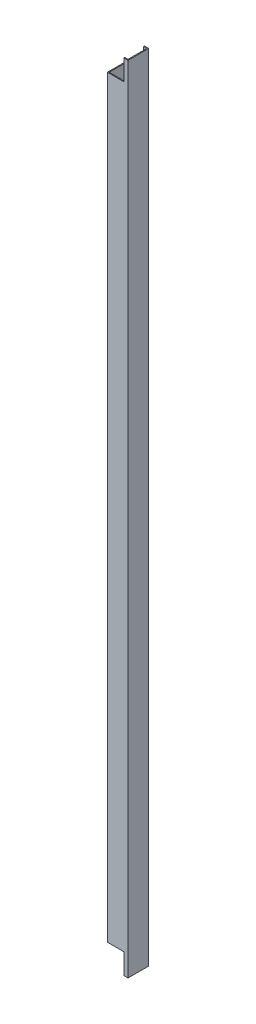
ISO-10303-21;
HEADER;
FILE_DESCRIPTION(('STEP AP214'),'2;1');
FILE_NAME('part.step','',(''),(''),'','','');
FILE_SCHEMA(('AUTOMOTIVE_DESIGN { 1 0 10303 214 1 1 1 1 }'));
ENDSEC;
DATA;
#1=APPLICATION_CONTEXT('core data for automotive mechanical design processes');
#2=APPLICATION_PROTOCOL_DEFINITION('international standard','automotive_design',2000,#1);
#3=PRODUCT_CONTEXT('',#1,'mechanical');
#4=PRODUCT('Part','Part','',(#3));
#5=PRODUCT_RELATED_PRODUCT_CATEGORY('part','',(#4));
#6=PRODUCT_DEFINITION_FORMATION('','',#4);
#7=PRODUCT_DEFINITION_CONTEXT('part definition',#1,'design');
#8=PRODUCT_DEFINITION('design','',#6,#7);
#9=PRODUCT_DEFINITION_SHAPE('','',#8);
#10=(LENGTH_UNIT() NAMED_UNIT(*) SI_UNIT(.MILLI.,.METRE.));
#11=(NAMED_UNIT(*) PLANE_ANGLE_UNIT() SI_UNIT($,.RADIAN.));
#12=(NAMED_UNIT(*) SI_UNIT($,.STERADIAN.) SOLID_ANGLE_UNIT());
#13=UNCERTAINTY_MEASURE_WITH_UNIT(LENGTH_MEASURE(1.E-05),#10,'distance_accuracy_value','');
#14=(GEOMETRIC_REPRESENTATION_CONTEXT(3) GLOBAL_UNCERTAINTY_ASSIGNED_CONTEXT((#13)) GLOBAL_UNIT_ASSIGNED_CONTEXT((#10,
#11,#12)) REPRESENTATION_CONTEXT('',''));
#15=CARTESIAN_POINT('',(0.,0.,0.));
#16=DIRECTION('',(0.,0.,1.));
#17=DIRECTION('',(1.,0.,0.));
#18=AXIS2_PLACEMENT_3D('',#15,#16,#17);
#19=CARTESIAN_POINT('',(0.,1923.,0.));
#20=DIRECTION('',(0.,-1.,0.));
#21=DIRECTION('',(0.,0.,-1.));
#22=AXIS2_PLACEMENT_3D('',#19,#20,#21);
#23=PLANE('',#22);
#24=DIRECTION('',(-1.,0.,0.));
#25=VECTOR('',#24,1.);
#26=CARTESIAN_POINT('',(0.,1923.,-50.));
#27=LINE('',#26,#25);
#28=CARTESIAN_POINT('',(50.,1923.,-50.));
#29=VERTEX_POINT('',#28);
#30=CARTESIAN_POINT('',(40.,1923.,-50.));
#31=VERTEX_POINT('',#30);
#32=EDGE_CURVE('E184',#29,#31,#27,.T.);
#33=ORIENTED_EDGE('',*,*,#32,.T.);
#34=DIRECTION('',(0.,0.,1.));
#35=VECTOR('',#34,1.);
#36=CARTESIAN_POINT('',(40.,1923.,-50.));
#37=LINE('',#36,#35);
#38=CARTESIAN_POINT('',(40.,1923.,-47.8));
#39=VERTEX_POINT('',#38);
#40=EDGE_CURVE('E257',#31,#39,#37,.T.);
#41=ORIENTED_EDGE('',*,*,#40,.T.);
#42=DIRECTION('',(-1.,0.,0.));
#43=VECTOR('',#42,1.);
#44=CARTESIAN_POINT('',(2.2,1923.,-47.8));
#45=LINE('',#44,#43);
#46=CARTESIAN_POINT('',(47.8,1923.,-47.8));
#47=VERTEX_POINT('',#46);
#48=EDGE_CURVE('E208',#47,#39,#45,.T.);
#49=ORIENTED_EDGE('',*,*,#48,.F.);
#50=DIRECTION('',(0.,0.,-1.));
#51=VECTOR('',#50,1.);
#52=CARTESIAN_POINT('',(47.8,1923.,-47.8));
#53=LINE('',#52,#51);
#54=CARTESIAN_POINT('',(47.8,1923.,-2.2));
#55=VERTEX_POINT('',#54);
#56=EDGE_CURVE('E213',#55,#47,#53,.T.);
#57=ORIENTED_EDGE('',*,*,#56,.F.);
#58=DIRECTION('',(1.,0.,0.));
#59=VECTOR('',#58,1.);
#60=CARTESIAN_POINT('',(47.8,1923.,-2.2));
#61=LINE('',#60,#59);
#62=CARTESIAN_POINT('',(40.,1923.,-2.2));
#63=VERTEX_POINT('',#62);
#64=EDGE_CURVE('E277',#63,#55,#61,.T.);
#65=ORIENTED_EDGE('',*,*,#64,.F.);
#66=CARTESIAN_POINT('',(40.,1923.,0.));
#67=VERTEX_POINT('',#66);
#68=EDGE_CURVE('E241',#63,#67,#37,.T.);
#69=ORIENTED_EDGE('',*,*,#68,.T.);
#70=DIRECTION('',(1.,0.,0.));
#71=VECTOR('',#70,1.);
#72=CARTESIAN_POINT('',(50.,1923.,0.));
#73=LINE('',#72,#71);
#74=CARTESIAN_POINT('',(50.,1923.,0.));
#75=VERTEX_POINT('',#74);
#76=EDGE_CURVE('E171',#67,#75,#73,.T.);
#77=ORIENTED_EDGE('',*,*,#76,.T.);
#78=DIRECTION('',(0.,0.,-1.));
#79=VECTOR('',#78,1.);
#80=CARTESIAN_POINT('',(50.,1923.,-50.));
#81=LINE('',#80,#79);
#82=EDGE_CURVE('E174',#75,#29,#81,.T.);
#83=ORIENTED_EDGE('',*,*,#82,.T.);
#84=EDGE_LOOP('',(#33,#41,#49,#57,#65,#69,#77,#83));
#85=FACE_BOUND('',#84,.T.);
#86=ADVANCED_FACE('F33',(#85),#23,.F.);
#87=CARTESIAN_POINT('',(0.,0.,0.));
#88=DIRECTION('',(0.,-1.,0.));
#89=DIRECTION('',(0.,0.,-1.));
#90=AXIS2_PLACEMENT_3D('',#87,#88,#89);
#91=PLANE('',#90);
#92=DIRECTION('',(0.,0.,1.));
#93=VECTOR('',#92,1.);
#94=CARTESIAN_POINT('',(40.,0.,-50.));
#95=LINE('',#94,#93);
#96=CARTESIAN_POINT('',(40.,0.,-50.));
#97=VERTEX_POINT('',#96);
#98=CARTESIAN_POINT('',(40.,0.,-47.8));
#99=VERTEX_POINT('',#98);
#100=EDGE_CURVE('E56',#97,#99,#95,.T.);
#101=ORIENTED_EDGE('',*,*,#100,.F.);
#102=DIRECTION('',(-1.,0.,0.));
#103=VECTOR('',#102,1.);
#104=CARTESIAN_POINT('',(0.,0.,-50.));
#105=LINE('',#104,#103);
#106=CARTESIAN_POINT('',(50.,0.,-50.));
#107=VERTEX_POINT('',#106);
#108=EDGE_CURVE('E159',#107,#97,#105,.T.);
#109=ORIENTED_EDGE('',*,*,#108,.F.);
#110=DIRECTION('',(0.,0.,-1.));
#111=VECTOR('',#110,1.);
#112=CARTESIAN_POINT('',(50.,0.,-50.));
#113=LINE('',#112,#111);
#114=CARTESIAN_POINT('',(50.,0.,0.));
#115=VERTEX_POINT('',#114);
#116=EDGE_CURVE('E172',#115,#107,#113,.T.);
#117=ORIENTED_EDGE('',*,*,#116,.F.);
#118=DIRECTION('',(1.,0.,0.));
#119=VECTOR('',#118,1.);
#120=CARTESIAN_POINT('',(50.,0.,0.));
#121=LINE('',#120,#119);
#122=CARTESIAN_POINT('',(40.,0.,0.));
#123=VERTEX_POINT('',#122);
#124=EDGE_CURVE('E176',#123,#115,#121,.T.);
#125=ORIENTED_EDGE('',*,*,#124,.F.);
#126=CARTESIAN_POINT('',(40.,0.,-2.2));
#127=VERTEX_POINT('',#126);
#128=EDGE_CURVE('E164',#127,#123,#95,.T.);
#129=ORIENTED_EDGE('',*,*,#128,.F.);
#130=DIRECTION('',(1.,0.,0.));
#131=VECTOR('',#130,1.);
#132=CARTESIAN_POINT('',(47.8,0.,-2.2));
#133=LINE('',#132,#131);
#134=CARTESIAN_POINT('',(47.8,0.,-2.2));
#135=VERTEX_POINT('',#134);
#136=EDGE_CURVE('E276',#127,#135,#133,.T.);
#137=ORIENTED_EDGE('',*,*,#136,.T.);
#138=DIRECTION('',(0.,0.,-1.));
#139=VECTOR('',#138,1.);
#140=CARTESIAN_POINT('',(47.8,0.,-47.8));
#141=LINE('',#140,#139);
#142=CARTESIAN_POINT('',(47.8,0.,-47.8));
#143=VERTEX_POINT('',#142);
#144=EDGE_CURVE('E281',#135,#143,#141,.T.);
#145=ORIENTED_EDGE('',*,*,#144,.T.);
#146=DIRECTION('',(-1.,0.,0.));
#147=VECTOR('',#146,1.);
#148=CARTESIAN_POINT('',(2.2,0.,-47.8));
#149=LINE('',#148,#147);
#150=EDGE_CURVE('E162',#143,#99,#149,.T.);
#151=ORIENTED_EDGE('',*,*,#150,.T.);
#152=EDGE_LOOP('',(#101,#109,#117,#125,#129,#137,#145,#151));
#153=FACE_BOUND('',#152,.T.);
#154=ADVANCED_FACE('F157',(#153),#91,.T.);
#155=CARTESIAN_POINT('',(50.,1923.,0.));
#156=DIRECTION('',(0.,0.,-1.));
#157=DIRECTION('',(-1.,0.,0.));
#158=AXIS2_PLACEMENT_3D('',#155,#156,#157);
#159=PLANE('',#158);
#160=DIRECTION('',(0.,-1.,0.));
#161=VECTOR('',#160,1.);
#162=CARTESIAN_POINT('',(0.,1923.,0.));
#163=LINE('',#162,#161);
#164=CARTESIAN_POINT('',(0.,1873.,0.));
#165=VERTEX_POINT('',#164);
#166=CARTESIAN_POINT('',(0.,50.,0.));
#167=VERTEX_POINT('',#166);
#168=EDGE_CURVE('E180',#165,#167,#163,.T.);
#169=ORIENTED_EDGE('',*,*,#168,.T.);
#170=DIRECTION('',(-1.,0.,0.));
#171=VECTOR('',#170,1.);
#172=CARTESIAN_POINT('',(0.,50.,0.));
#173=LINE('',#172,#171);
#174=CARTESIAN_POINT('',(40.,50.,0.));
#175=VERTEX_POINT('',#174);
#176=EDGE_CURVE('E152',#175,#167,#173,.T.);
#177=ORIENTED_EDGE('',*,*,#176,.F.);
#178=DIRECTION('',(0.,1.,0.));
#179=VECTOR('',#178,1.);
#180=CARTESIAN_POINT('',(40.,50.,0.));
#181=LINE('',#180,#179);
#182=EDGE_CURVE('E232',#123,#175,#181,.T.);
#183=ORIENTED_EDGE('',*,*,#182,.F.);
#184=ORIENTED_EDGE('',*,*,#124,.T.);
#185=DIRECTION('',(0.,-1.,0.));
#186=VECTOR('',#185,1.);
#187=CARTESIAN_POINT('',(50.,1923.,0.));
#188=LINE('',#187,#186);
#189=EDGE_CURVE('E188',#75,#115,#188,.T.);
#190=ORIENTED_EDGE('',*,*,#189,.F.);
#191=ORIENTED_EDGE('',*,*,#76,.F.);
#192=DIRECTION('',(0.,1.,0.));
#193=VECTOR('',#192,1.);
#194=CARTESIAN_POINT('',(40.,1923.,0.));
#195=LINE('',#194,#193);
#196=CARTESIAN_POINT('',(40.,1873.,0.));
#197=VERTEX_POINT('',#196);
#198=EDGE_CURVE('E244',#197,#67,#195,.T.);
#199=ORIENTED_EDGE('',*,*,#198,.F.);
#200=DIRECTION('',(1.,0.,0.));
#201=VECTOR('',#200,1.);
#202=CARTESIAN_POINT('',(40.,1873.,0.));
#203=LINE('',#202,#201);
#204=EDGE_CURVE('E246',#165,#197,#203,.T.);
#205=ORIENTED_EDGE('',*,*,#204,.F.);
#206=EDGE_LOOP('',(#169,#177,#183,#184,#190,#191,#199,#205));
#207=FACE_BOUND('',#206,.T.);
#208=ADVANCED_FACE('F35',(#207),#159,.F.);
#209=CARTESIAN_POINT('',(50.,1923.,-50.));
#210=DIRECTION('',(-1.,0.,0.));
#211=DIRECTION('',(0.,0.,1.));
#212=AXIS2_PLACEMENT_3D('',#209,#210,#211);
#213=PLANE('',#212);
#214=ORIENTED_EDGE('',*,*,#116,.T.);
#215=DIRECTION('',(0.,-1.,0.));
#216=VECTOR('',#215,1.);
#217=CARTESIAN_POINT('',(50.,1923.,-50.));
#218=LINE('',#217,#216);
#219=EDGE_CURVE('E170',#29,#107,#218,.T.);
#220=ORIENTED_EDGE('',*,*,#219,.F.);
#221=ORIENTED_EDGE('',*,*,#82,.F.);
#222=ORIENTED_EDGE('',*,*,#189,.T.);
#223=EDGE_LOOP('',(#214,#220,#221,#222));
#224=FACE_BOUND('',#223,.T.);
#225=ADVANCED_FACE('F236',(#224),#213,.F.);
#226=CARTESIAN_POINT('',(0.,1923.,-50.));
#227=DIRECTION('',(0.,0.,1.));
#228=DIRECTION('',(1.,0.,0.));
#229=AXIS2_PLACEMENT_3D('',#226,#227,#228);
#230=PLANE('',#229);
#231=DIRECTION('',(0.,1.,0.));
#232=VECTOR('',#231,1.);
#233=CARTESIAN_POINT('',(40.,50.,-50.));
#234=LINE('',#233,#232);
#235=CARTESIAN_POINT('',(40.,50.,-50.));
#236=VERTEX_POINT('',#235);
#237=EDGE_CURVE('E143',#97,#236,#234,.T.);
#238=ORIENTED_EDGE('',*,*,#237,.T.);
#239=DIRECTION('',(-1.,0.,0.));
#240=VECTOR('',#239,1.);
#241=CARTESIAN_POINT('',(0.,50.,-50.));
#242=LINE('',#241,#240);
#243=CARTESIAN_POINT('',(0.,50.,-50.));
#244=VERTEX_POINT('',#243);
#245=EDGE_CURVE('E151',#236,#244,#242,.T.);
#246=ORIENTED_EDGE('',*,*,#245,.T.);
#247=DIRECTION('',(0.,-1.,0.));
#248=VECTOR('',#247,1.);
#249=CARTESIAN_POINT('',(0.,1923.,-50.));
#250=LINE('',#249,#248);
#251=CARTESIAN_POINT('',(0.,1873.,-50.));
#252=VERTEX_POINT('',#251);
#253=EDGE_CURVE('E183',#252,#244,#250,.T.);
#254=ORIENTED_EDGE('',*,*,#253,.F.);
#255=DIRECTION('',(1.,0.,0.));
#256=VECTOR('',#255,1.);
#257=CARTESIAN_POINT('',(40.,1873.,-50.));
#258=LINE('',#257,#256);
#259=CARTESIAN_POINT('',(40.,1873.,-50.));
#260=VERTEX_POINT('',#259);
#261=EDGE_CURVE('E249',#252,#260,#258,.T.);
#262=ORIENTED_EDGE('',*,*,#261,.T.);
#263=DIRECTION('',(0.,1.,0.));
#264=VECTOR('',#263,1.);
#265=CARTESIAN_POINT('',(40.,1923.,-50.));
#266=LINE('',#265,#264);
#267=EDGE_CURVE('E252',#260,#31,#266,.T.);
#268=ORIENTED_EDGE('',*,*,#267,.T.);
#269=ORIENTED_EDGE('',*,*,#32,.F.);
#270=ORIENTED_EDGE('',*,*,#219,.T.);
#271=ORIENTED_EDGE('',*,*,#108,.T.);
#272=EDGE_LOOP('',(#238,#246,#254,#262,#268,#269,#270,#271));
#273=FACE_BOUND('',#272,.T.);
#274=ADVANCED_FACE('F167',(#273),#230,.F.);
#275=CARTESIAN_POINT('',(0.,1923.,0.));
#276=DIRECTION('',(1.,0.,0.));
#277=DIRECTION('',(0.,0.,-1.));
#278=AXIS2_PLACEMENT_3D('',#275,#276,#277);
#279=PLANE('',#278);
#280=ORIENTED_EDGE('',*,*,#253,.T.);
#281=DIRECTION('',(0.,0.,1.));
#282=VECTOR('',#281,1.);
#283=CARTESIAN_POINT('',(0.,50.,-50.));
#284=LINE('',#283,#282);
#285=EDGE_CURVE('E199',#244,#167,#284,.T.);
#286=ORIENTED_EDGE('',*,*,#285,.T.);
#287=ORIENTED_EDGE('',*,*,#168,.F.);
#288=DIRECTION('',(0.,0.,1.));
#289=VECTOR('',#288,1.);
#290=CARTESIAN_POINT('',(0.,1873.,-50.));
#291=LINE('',#290,#289);
#292=EDGE_CURVE('E263',#252,#165,#291,.T.);
#293=ORIENTED_EDGE('',*,*,#292,.F.);
#294=EDGE_LOOP('',(#280,#286,#287,#293));
#295=FACE_BOUND('',#294,.T.);
#296=ADVANCED_FACE('F314',(#295),#279,.F.);
#297=CARTESIAN_POINT('',(2.2,1923.,-2.2));
#298=DIRECTION('',(1.,0.,0.));
#299=DIRECTION('',(0.,0.,-1.));
#300=AXIS2_PLACEMENT_3D('',#297,#298,#299);
#301=PLANE('',#300);
#302=DIRECTION('',(0.,0.,1.));
#303=VECTOR('',#302,1.);
#304=CARTESIAN_POINT('',(2.2,50.,-2.2));
#305=LINE('',#304,#303);
#306=CARTESIAN_POINT('',(2.2,50.,-47.8));
#307=VERTEX_POINT('',#306);
#308=CARTESIAN_POINT('',(2.2,50.,-2.2));
#309=VERTEX_POINT('',#308);
#310=EDGE_CURVE('E272',#307,#309,#305,.T.);
#311=ORIENTED_EDGE('',*,*,#310,.F.);
#312=DIRECTION('',(0.,-1.,0.));
#313=VECTOR('',#312,1.);
#314=CARTESIAN_POINT('',(2.2,1923.,-47.8));
#315=LINE('',#314,#313);
#316=CARTESIAN_POINT('',(2.2,1873.,-47.8));
#317=VERTEX_POINT('',#316);
#318=EDGE_CURVE('E204',#317,#307,#315,.T.);
#319=ORIENTED_EDGE('',*,*,#318,.F.);
#320=DIRECTION('',(0.,0.,-1.));
#321=VECTOR('',#320,1.);
#322=CARTESIAN_POINT('',(2.2,1873.,-2.2));
#323=LINE('',#322,#321);
#324=CARTESIAN_POINT('',(2.2,1873.,-2.2));
#325=VERTEX_POINT('',#324);
#326=EDGE_CURVE('E48',#325,#317,#323,.T.);
#327=ORIENTED_EDGE('',*,*,#326,.F.);
#328=DIRECTION('',(0.,-1.,0.));
#329=VECTOR('',#328,1.);
#330=CARTESIAN_POINT('',(2.2,1923.,-2.2));
#331=LINE('',#330,#329);
#332=EDGE_CURVE('E220',#325,#309,#331,.T.);
#333=ORIENTED_EDGE('',*,*,#332,.T.);
#334=EDGE_LOOP('',(#311,#319,#327,#333));
#335=FACE_BOUND('',#334,.T.);
#336=ADVANCED_FACE('F315',(#335),#301,.T.);
#337=CARTESIAN_POINT('',(47.8,1923.,-2.2));
#338=DIRECTION('',(0.,0.,-1.));
#339=DIRECTION('',(-1.,0.,0.));
#340=AXIS2_PLACEMENT_3D('',#337,#338,#339);
#341=PLANE('',#340);
#342=DIRECTION('',(1.,0.,0.));
#343=VECTOR('',#342,1.);
#344=CARTESIAN_POINT('',(47.8,50.,-2.2));
#345=LINE('',#344,#343);
#346=CARTESIAN_POINT('',(40.,50.,-2.2));
#347=VERTEX_POINT('',#346);
#348=EDGE_CURVE('E274',#309,#347,#345,.T.);
#349=ORIENTED_EDGE('',*,*,#348,.F.);
#350=ORIENTED_EDGE('',*,*,#332,.F.);
#351=DIRECTION('',(-1.,0.,0.));
#352=VECTOR('',#351,1.);
#353=CARTESIAN_POINT('',(47.8,1873.,-2.2));
#354=LINE('',#353,#352);
#355=CARTESIAN_POINT('',(40.,1873.,-2.2));
#356=VERTEX_POINT('',#355);
#357=EDGE_CURVE('E266',#356,#325,#354,.T.);
#358=ORIENTED_EDGE('',*,*,#357,.F.);
#359=DIRECTION('',(0.,-1.,0.));
#360=VECTOR('',#359,1.);
#361=CARTESIAN_POINT('',(40.,1923.,-2.2));
#362=LINE('',#361,#360);
#363=EDGE_CURVE('E268',#63,#356,#362,.T.);
#364=ORIENTED_EDGE('',*,*,#363,.F.);
#365=ORIENTED_EDGE('',*,*,#64,.T.);
#366=DIRECTION('',(0.,-1.,0.));
#367=VECTOR('',#366,1.);
#368=CARTESIAN_POINT('',(47.8,1923.,-2.2));
#369=LINE('',#368,#367);
#370=EDGE_CURVE('E210',#55,#135,#369,.T.);
#371=ORIENTED_EDGE('',*,*,#370,.T.);
#372=ORIENTED_EDGE('',*,*,#136,.F.);
#373=DIRECTION('',(0.,-1.,0.));
#374=VECTOR('',#373,1.);
#375=CARTESIAN_POINT('',(39.9999999999997,1923.,-2.2));
#376=LINE('',#375,#374);
#377=EDGE_CURVE('E270',#347,#127,#376,.T.);
#378=ORIENTED_EDGE('',*,*,#377,.F.);
#379=EDGE_LOOP('',(#349,#350,#358,#364,#365,#371,#372,#378));
#380=FACE_BOUND('',#379,.T.);
#381=ADVANCED_FACE('F305',(#380),#341,.T.);
#382=CARTESIAN_POINT('',(47.8,1923.,-47.8));
#383=DIRECTION('',(-1.,0.,0.));
#384=DIRECTION('',(0.,0.,1.));
#385=AXIS2_PLACEMENT_3D('',#382,#383,#384);
#386=PLANE('',#385);
#387=ORIENTED_EDGE('',*,*,#144,.F.);
#388=ORIENTED_EDGE('',*,*,#370,.F.);
#389=ORIENTED_EDGE('',*,*,#56,.T.);
#390=DIRECTION('',(0.,-1.,0.));
#391=VECTOR('',#390,1.);
#392=CARTESIAN_POINT('',(47.8,1923.,-47.8));
#393=LINE('',#392,#391);
#394=EDGE_CURVE('E207',#47,#143,#393,.T.);
#395=ORIENTED_EDGE('',*,*,#394,.T.);
#396=EDGE_LOOP('',(#387,#388,#389,#395));
#397=FACE_BOUND('',#396,.T.);
#398=ADVANCED_FACE('F286',(#397),#386,.T.);
#399=CARTESIAN_POINT('',(2.2,1923.,-47.8));
#400=DIRECTION('',(0.,0.,1.));
#401=DIRECTION('',(1.,0.,0.));
#402=AXIS2_PLACEMENT_3D('',#399,#400,#401);
#403=PLANE('',#402);
#404=DIRECTION('',(-1.,0.,0.));
#405=VECTOR('',#404,1.);
#406=CARTESIAN_POINT('',(2.2,50.,-47.8));
#407=LINE('',#406,#405);
#408=CARTESIAN_POINT('',(40.,50.,-47.8));
#409=VERTEX_POINT('',#408);
#410=EDGE_CURVE('E11',#409,#307,#407,.T.);
#411=ORIENTED_EDGE('',*,*,#410,.F.);
#412=DIRECTION('',(0.,1.,0.));
#413=VECTOR('',#412,1.);
#414=CARTESIAN_POINT('',(39.9999999999997,1923.,-47.8));
#415=LINE('',#414,#413);
#416=EDGE_CURVE('E41',#99,#409,#415,.T.);
#417=ORIENTED_EDGE('',*,*,#416,.F.);
#418=ORIENTED_EDGE('',*,*,#150,.F.);
#419=ORIENTED_EDGE('',*,*,#394,.F.);
#420=ORIENTED_EDGE('',*,*,#48,.T.);
#421=DIRECTION('',(0.,1.,0.));
#422=VECTOR('',#421,1.);
#423=CARTESIAN_POINT('',(40.,1923.,-47.8));
#424=LINE('',#423,#422);
#425=CARTESIAN_POINT('',(40.,1873.,-47.8));
#426=VERTEX_POINT('',#425);
#427=EDGE_CURVE('E193',#426,#39,#424,.T.);
#428=ORIENTED_EDGE('',*,*,#427,.F.);
#429=DIRECTION('',(1.,0.,0.));
#430=VECTOR('',#429,1.);
#431=CARTESIAN_POINT('',(2.2,1873.,-47.8));
#432=LINE('',#431,#430);
#433=EDGE_CURVE('E191',#317,#426,#432,.T.);
#434=ORIENTED_EDGE('',*,*,#433,.F.);
#435=ORIENTED_EDGE('',*,*,#318,.T.);
#436=EDGE_LOOP('',(#411,#417,#418,#419,#420,#428,#434,#435));
#437=FACE_BOUND('',#436,.T.);
#438=ADVANCED_FACE('F202',(#437),#403,.T.);
#439=CARTESIAN_POINT('',(40.,1923.,-50.));
#440=DIRECTION('',(1.,0.,0.));
#441=DIRECTION('',(0.,1.,0.));
#442=AXIS2_PLACEMENT_3D('',#439,#440,#441);
#443=PLANE('',#442);
#444=ORIENTED_EDGE('',*,*,#363,.T.);
#445=DIRECTION('',(0.,0.,1.));
#446=VECTOR('',#445,1.);
#447=CARTESIAN_POINT('',(40.,1873.,-50.));
#448=LINE('',#447,#446);
#449=EDGE_CURVE('E262',#356,#197,#448,.T.);
#450=ORIENTED_EDGE('',*,*,#449,.T.);
#451=ORIENTED_EDGE('',*,*,#198,.T.);
#452=ORIENTED_EDGE('',*,*,#68,.F.);
#453=EDGE_LOOP('',(#444,#450,#451,#452));
#454=FACE_BOUND('',#453,.T.);
#455=ADVANCED_FACE('F310',(#454),#443,.F.);
#456=ORIENTED_EDGE('',*,*,#427,.T.);
#457=ORIENTED_EDGE('',*,*,#40,.F.);
#458=ORIENTED_EDGE('',*,*,#267,.F.);
#459=EDGE_CURVE('E259',#260,#426,#448,.T.);
#460=ORIENTED_EDGE('',*,*,#459,.T.);
#461=EDGE_LOOP('',(#456,#457,#458,#460));
#462=FACE_BOUND('',#461,.T.);
#463=ADVANCED_FACE('F292',(#462),#443,.F.);
#464=CARTESIAN_POINT('',(40.,1873.,-50.));
#465=DIRECTION('',(0.,-1.,0.));
#466=DIRECTION('',(0.,0.,-1.));
#467=AXIS2_PLACEMENT_3D('',#464,#465,#466);
#468=PLANE('',#467);
#469=ORIENTED_EDGE('',*,*,#357,.T.);
#470=ORIENTED_EDGE('',*,*,#326,.T.);
#471=ORIENTED_EDGE('',*,*,#433,.T.);
#472=ORIENTED_EDGE('',*,*,#459,.F.);
#473=ORIENTED_EDGE('',*,*,#261,.F.);
#474=ORIENTED_EDGE('',*,*,#292,.T.);
#475=ORIENTED_EDGE('',*,*,#204,.T.);
#476=ORIENTED_EDGE('',*,*,#449,.F.);
#477=EDGE_LOOP('',(#469,#470,#471,#472,#473,#474,#475,#476));
#478=FACE_BOUND('',#477,.T.);
#479=ADVANCED_FACE('F311',(#478),#468,.F.);
#480=CARTESIAN_POINT('',(40.,50.,-50.));
#481=DIRECTION('',(1.,0.,0.));
#482=DIRECTION('',(0.,1.,0.));
#483=AXIS2_PLACEMENT_3D('',#480,#481,#482);
#484=PLANE('',#483);
#485=ORIENTED_EDGE('',*,*,#377,.T.);
#486=ORIENTED_EDGE('',*,*,#128,.T.);
#487=ORIENTED_EDGE('',*,*,#182,.T.);
#488=DIRECTION('',(0.,0.,1.));
#489=VECTOR('',#488,1.);
#490=CARTESIAN_POINT('',(40.,50.,-50.));
#491=LINE('',#490,#489);
#492=EDGE_CURVE('E163',#347,#175,#491,.T.);
#493=ORIENTED_EDGE('',*,*,#492,.F.);
#494=EDGE_LOOP('',(#485,#486,#487,#493));
#495=FACE_BOUND('',#494,.T.);
#496=ADVANCED_FACE('F300',(#495),#484,.F.);
#497=CARTESIAN_POINT('',(0.,50.,-50.));
#498=DIRECTION('',(0.,1.,0.));
#499=DIRECTION('',(0.,0.,1.));
#500=AXIS2_PLACEMENT_3D('',#497,#498,#499);
#501=PLANE('',#500);
#502=ORIENTED_EDGE('',*,*,#348,.T.);
#503=ORIENTED_EDGE('',*,*,#492,.T.);
#504=ORIENTED_EDGE('',*,*,#176,.T.);
#505=ORIENTED_EDGE('',*,*,#285,.F.);
#506=ORIENTED_EDGE('',*,*,#245,.F.);
#507=EDGE_CURVE('E146',#236,#409,#491,.T.);
#508=ORIENTED_EDGE('',*,*,#507,.T.);
#509=ORIENTED_EDGE('',*,*,#410,.T.);
#510=ORIENTED_EDGE('',*,*,#310,.T.);
#511=EDGE_LOOP('',(#502,#503,#504,#505,#506,#508,#509,#510));
#512=FACE_BOUND('',#511,.T.);
#513=ADVANCED_FACE('F197',(#512),#501,.F.);
#514=ORIENTED_EDGE('',*,*,#416,.T.);
#515=ORIENTED_EDGE('',*,*,#507,.F.);
#516=ORIENTED_EDGE('',*,*,#237,.F.);
#517=ORIENTED_EDGE('',*,*,#100,.T.);
#518=EDGE_LOOP('',(#514,#515,#516,#517));
#519=FACE_BOUND('',#518,.T.);
#520=ADVANCED_FACE('F144',(#519),#484,.F.);
#521=CLOSED_SHELL('',(#86,#154,#208,#225,#274,#296,#336,#381,#398,#438,#455,#463,#479,#496,#513,#520));
#522=MANIFOLD_SOLID_BREP('B2',#521);
#523=ADVANCED_BREP_SHAPE_REPRESENTATION('',(#18,#522),#14);
#524=SHAPE_DEFINITION_REPRESENTATION(#9,#523);
ENDSEC;
END-ISO-10303-21;
